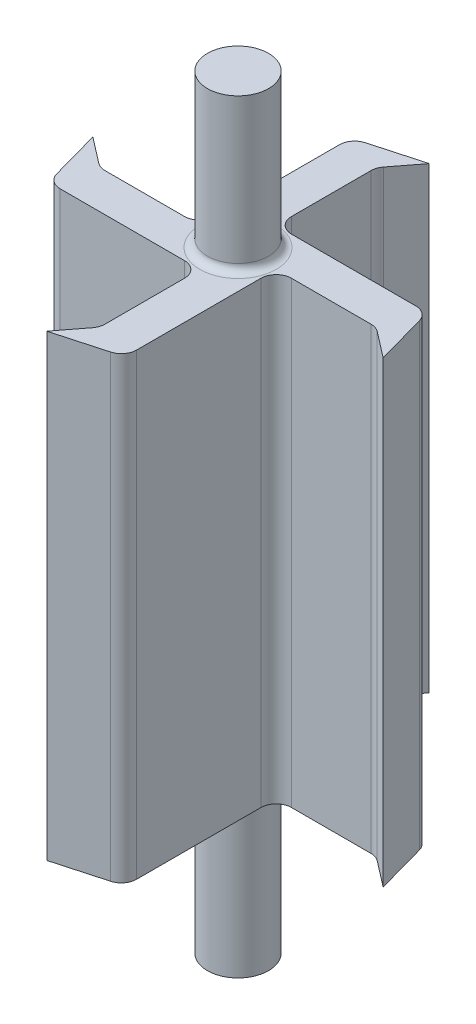
ISO-10303-21;
HEADER;
FILE_DESCRIPTION(('STEP AP214'),'2;1');
FILE_NAME('part.step','',(''),(''),'','','');
FILE_SCHEMA(('AUTOMOTIVE_DESIGN { 1 0 10303 214 1 1 1 1 }'));
ENDSEC;
DATA;
#1=APPLICATION_CONTEXT('core data for automotive mechanical design processes');
#2=APPLICATION_PROTOCOL_DEFINITION('international standard','automotive_design',2000,#1);
#3=PRODUCT_CONTEXT('',#1,'mechanical');
#4=PRODUCT('Part','Part','',(#3));
#5=PRODUCT_RELATED_PRODUCT_CATEGORY('part','',(#4));
#6=PRODUCT_DEFINITION_FORMATION('','',#4);
#7=PRODUCT_DEFINITION_CONTEXT('part definition',#1,'design');
#8=PRODUCT_DEFINITION('design','',#6,#7);
#9=PRODUCT_DEFINITION_SHAPE('','',#8);
#10=(LENGTH_UNIT() NAMED_UNIT(*) SI_UNIT(.MILLI.,.METRE.));
#11=(NAMED_UNIT(*) PLANE_ANGLE_UNIT() SI_UNIT($,.RADIAN.));
#12=(NAMED_UNIT(*) SI_UNIT($,.STERADIAN.) SOLID_ANGLE_UNIT());
#13=UNCERTAINTY_MEASURE_WITH_UNIT(LENGTH_MEASURE(1.E-05),#10,'distance_accuracy_value','');
#14=(GEOMETRIC_REPRESENTATION_CONTEXT(3) GLOBAL_UNCERTAINTY_ASSIGNED_CONTEXT((#13)) GLOBAL_UNIT_ASSIGNED_CONTEXT((#10,
#11,#12)) REPRESENTATION_CONTEXT('',''));
#15=CARTESIAN_POINT('',(0.,0.,0.));
#16=DIRECTION('',(0.,0.,1.));
#17=DIRECTION('',(1.,0.,0.));
#18=AXIS2_PLACEMENT_3D('',#15,#16,#17);
#19=CARTESIAN_POINT('',(0.,60.,-5.));
#20=DIRECTION('',(0.,0.,-1.));
#21=DIRECTION('',(-1.,0.,0.));
#22=AXIS2_PLACEMENT_3D('',#19,#20,#21);
#23=PLANE('',#22);
#24=DIRECTION('',(1.,0.,0.));
#25=VECTOR('',#24,1.);
#26=CARTESIAN_POINT('',(0.,0.,-5.));
#27=LINE('',#26,#25);
#28=CARTESIAN_POINT('',(1.99999999999998,0.,-4.99999999999999));
#29=VERTEX_POINT('',#28);
#30=CARTESIAN_POINT('',(18.270384004832,0.,-4.99999999999994));
#31=VERTEX_POINT('',#30);
#32=EDGE_CURVE('E286',#29,#31,#27,.T.);
#33=ORIENTED_EDGE('',*,*,#32,.F.);
#34=DIRECTION('',(0.,-1.,0.));
#35=VECTOR('',#34,1.);
#36=CARTESIAN_POINT('',(1.99999999999998,60.,-4.99999999999999));
#37=LINE('',#36,#35);
#38=CARTESIAN_POINT('',(1.99999999999998,60.,-4.99999999999999));
#39=VERTEX_POINT('',#38);
#40=EDGE_CURVE('E387',#29,#39,#37,.F.);
#41=ORIENTED_EDGE('',*,*,#40,.T.);
#42=DIRECTION('',(1.,0.,0.));
#43=VECTOR('',#42,1.);
#44=CARTESIAN_POINT('',(0.,60.,-5.));
#45=LINE('',#44,#43);
#46=CARTESIAN_POINT('',(18.270384004832,60.,-4.99999999999994));
#47=VERTEX_POINT('',#46);
#48=EDGE_CURVE('E328',#39,#47,#45,.T.);
#49=ORIENTED_EDGE('',*,*,#48,.T.);
#50=DIRECTION('',(0.,-1.,0.));
#51=VECTOR('',#50,1.);
#52=CARTESIAN_POINT('',(18.270384004832,0.,-4.99999999999994));
#53=LINE('',#52,#51);
#54=EDGE_CURVE('E384',#47,#31,#53,.T.);
#55=ORIENTED_EDGE('',*,*,#54,.T.);
#56=EDGE_LOOP('',(#33,#41,#49,#55));
#57=FACE_BOUND('',#56,.T.);
#58=ADVANCED_FACE('F35',(#57),#23,.T.);
#59=CARTESIAN_POINT('',(0.,60.,0.));
#60=DIRECTION('',(1.,0.,0.));
#61=DIRECTION('',(0.,0.,-1.));
#62=AXIS2_PLACEMENT_3D('',#59,#60,#61);
#63=PLANE('',#62);
#64=DIRECTION('',(0.,0.,1.));
#65=VECTOR('',#64,1.);
#66=CARTESIAN_POINT('',(0.,60.,0.));
#67=LINE('',#66,#65);
#68=CARTESIAN_POINT('',(0.,60.,-17.4155207280463));
#69=VERTEX_POINT('',#68);
#70=CARTESIAN_POINT('',(0.,60.,-6.99999999999999));
#71=VERTEX_POINT('',#70);
#72=EDGE_CURVE('E235',#69,#71,#67,.T.);
#73=ORIENTED_EDGE('',*,*,#72,.T.);
#74=DIRECTION('',(0.,-1.,0.));
#75=VECTOR('',#74,1.);
#76=CARTESIAN_POINT('',(0.,0.,-6.99999999999999));
#77=LINE('',#76,#75);
#78=CARTESIAN_POINT('',(0.,0.,-6.99999999999999));
#79=VERTEX_POINT('',#78);
#80=EDGE_CURVE('E381',#71,#79,#77,.T.);
#81=ORIENTED_EDGE('',*,*,#80,.T.);
#82=DIRECTION('',(0.,0.,1.));
#83=VECTOR('',#82,1.);
#84=CARTESIAN_POINT('',(0.,0.,0.));
#85=LINE('',#84,#83);
#86=CARTESIAN_POINT('',(0.,0.,-17.4155207280463));
#87=VERTEX_POINT('',#86);
#88=EDGE_CURVE('E289',#87,#79,#85,.T.);
#89=ORIENTED_EDGE('',*,*,#88,.F.);
#90=DIRECTION('',(0.,-1.,0.));
#91=VECTOR('',#90,1.);
#92=CARTESIAN_POINT('',(0.,60.,-17.4155207280463));
#93=LINE('',#92,#91);
#94=EDGE_CURVE('E379',#87,#69,#93,.F.);
#95=ORIENTED_EDGE('',*,*,#94,.T.);
#96=EDGE_LOOP('',(#73,#81,#89,#95));
#97=FACE_BOUND('',#96,.T.);
#98=ADVANCED_FACE('F457',(#97),#63,.T.);
#99=CARTESIAN_POINT('',(-8.74677947666396,60.,-6.73263582037778));
#100=DIRECTION('',(-0.792433760747938,0.,-0.609957977918873));
#101=DIRECTION('',(-0.609957977918873,0.,0.792433760747938));
#102=AXIS2_PLACEMENT_3D('',#99,#100,#101);
#103=PLANE('',#102);
#104=DIRECTION('',(0.609957977918873,0.,-0.792433760747938));
#105=VECTOR('',#104,1.);
#106=CARTESIAN_POINT('',(-8.74677947666396,60.,-6.73263582037778));
#107=LINE('',#106,#105);
#108=CARTESIAN_POINT('',(0.415132478504087,60.,-18.6354366838841));
#109=VERTEX_POINT('',#108);
#110=CARTESIAN_POINT('',(3.017767954205,60.,-22.0166798064062));
#111=VERTEX_POINT('',#110);
#112=EDGE_CURVE('E222',#109,#111,#107,.T.);
#113=ORIENTED_EDGE('',*,*,#112,.F.);
#114=DIRECTION('',(0.,-1.,0.));
#115=VECTOR('',#114,1.);
#116=CARTESIAN_POINT('',(0.415132478504086,60.,-18.6354366838841));
#117=LINE('',#116,#115);
#118=CARTESIAN_POINT('',(0.415132478504087,0.,-18.6354366838841));
#119=VERTEX_POINT('',#118);
#120=EDGE_CURVE('E405',#109,#119,#117,.T.);
#121=ORIENTED_EDGE('',*,*,#120,.T.);
#122=DIRECTION('',(0.609957977918873,0.,-0.792433760747938));
#123=VECTOR('',#122,1.);
#124=CARTESIAN_POINT('',(-8.74677947666396,0.,-6.73263582037778));
#125=LINE('',#124,#123);
#126=CARTESIAN_POINT('',(3.017767954205,0.,-22.0166798064062));
#127=VERTEX_POINT('',#126);
#128=EDGE_CURVE('E241',#119,#127,#125,.T.);
#129=ORIENTED_EDGE('',*,*,#128,.T.);
#130=DIRECTION('',(0.,-1.,0.));
#131=VECTOR('',#130,1.);
#132=CARTESIAN_POINT('',(3.017767954205,60.,-22.0166798064062));
#133=LINE('',#132,#131);
#134=EDGE_CURVE('E238',#111,#127,#133,.T.);
#135=ORIENTED_EDGE('',*,*,#134,.F.);
#136=EDGE_LOOP('',(#113,#121,#129,#135));
#137=FACE_BOUND('',#136,.T.);
#138=ADVANCED_FACE('F239',(#137),#103,.F.);
#139=CARTESIAN_POINT('',(-5.45894759484827,60.,-19.6633732056079));
#140=DIRECTION('',(0.267502810869766,0.,0.96355707987476));
#141=DIRECTION('',(0.96355707987476,0.,-0.267502810869766));
#142=AXIS2_PLACEMENT_3D('',#139,#140,#141);
#143=PLANE('',#142);
#144=DIRECTION('',(-0.96355707987476,0.,0.267502810869766));
#145=VECTOR('',#144,1.);
#146=CARTESIAN_POINT('',(-5.45894759484827,0.,-19.6633732056079));
#147=LINE('',#146,#145);
#148=CARTESIAN_POINT('',(-3.53500562173953,0.,-20.1974981645816));
#149=VERTEX_POINT('',#148);
#150=EDGE_CURVE('E294',#127,#149,#147,.T.);
#151=ORIENTED_EDGE('',*,*,#150,.T.);
#152=DIRECTION('',(0.,-1.,0.));
#153=VECTOR('',#152,1.);
#154=CARTESIAN_POINT('',(-3.53500562173953,60.,-20.1974981645816));
#155=LINE('',#154,#153);
#156=CARTESIAN_POINT('',(-3.53500562173953,60.,-20.1974981645816));
#157=VERTEX_POINT('',#156);
#158=EDGE_CURVE('E250',#149,#157,#155,.F.);
#159=ORIENTED_EDGE('',*,*,#158,.T.);
#160=DIRECTION('',(-0.96355707987476,0.,0.267502810869766));
#161=VECTOR('',#160,1.);
#162=CARTESIAN_POINT('',(-5.45894759484827,60.,-19.6633732056079));
#163=LINE('',#162,#161);
#164=EDGE_CURVE('E227',#111,#157,#163,.T.);
#165=ORIENTED_EDGE('',*,*,#164,.F.);
#166=ORIENTED_EDGE('',*,*,#134,.T.);
#167=EDGE_LOOP('',(#151,#159,#165,#166));
#168=FACE_BOUND('',#167,.T.);
#169=ADVANCED_FACE('F248',(#168),#143,.F.);
#170=CARTESIAN_POINT('',(-5.,60.,0.));
#171=DIRECTION('',(-1.,0.,0.));
#172=DIRECTION('',(0.,0.,1.));
#173=AXIS2_PLACEMENT_3D('',#170,#171,#172);
#174=PLANE('',#173);
#175=DIRECTION('',(0.,0.,-1.));
#176=VECTOR('',#175,1.);
#177=CARTESIAN_POINT('',(-5.,0.,0.));
#178=LINE('',#177,#176);
#179=CARTESIAN_POINT('',(-5.,0.,-2.0000000000001));
#180=VERTEX_POINT('',#179);
#181=CARTESIAN_POINT('',(-5.,0.,-18.270384004832));
#182=VERTEX_POINT('',#181);
#183=EDGE_CURVE('E296',#180,#182,#178,.T.);
#184=ORIENTED_EDGE('',*,*,#183,.F.);
#185=DIRECTION('',(0.,-1.,0.));
#186=VECTOR('',#185,1.);
#187=CARTESIAN_POINT('',(-5.,60.,-2.0000000000001));
#188=LINE('',#187,#186);
#189=CARTESIAN_POINT('',(-5.,60.,-2.0000000000001));
#190=VERTEX_POINT('',#189);
#191=EDGE_CURVE('E343',#180,#190,#188,.F.);
#192=ORIENTED_EDGE('',*,*,#191,.T.);
#193=DIRECTION('',(0.,0.,-1.));
#194=VECTOR('',#193,1.);
#195=CARTESIAN_POINT('',(-5.,60.,0.));
#196=LINE('',#195,#194);
#197=CARTESIAN_POINT('',(-5.,60.,-18.270384004832));
#198=VERTEX_POINT('',#197);
#199=EDGE_CURVE('E251',#190,#198,#196,.T.);
#200=ORIENTED_EDGE('',*,*,#199,.T.);
#201=DIRECTION('',(0.,-1.,0.));
#202=VECTOR('',#201,1.);
#203=CARTESIAN_POINT('',(-5.,0.,-18.270384004832));
#204=LINE('',#203,#202);
#205=EDGE_CURVE('E340',#198,#182,#204,.T.);
#206=ORIENTED_EDGE('',*,*,#205,.T.);
#207=EDGE_LOOP('',(#184,#192,#200,#206));
#208=FACE_BOUND('',#207,.T.);
#209=ADVANCED_FACE('F528',(#208),#174,.T.);
#210=CARTESIAN_POINT('',(0.,60.,0.));
#211=DIRECTION('',(0.,0.,-1.));
#212=DIRECTION('',(-1.,0.,0.));
#213=AXIS2_PLACEMENT_3D('',#210,#211,#212);
#214=PLANE('',#213);
#215=DIRECTION('',(1.,0.,0.));
#216=VECTOR('',#215,1.);
#217=CARTESIAN_POINT('',(0.,60.,0.));
#218=LINE('',#217,#216);
#219=CARTESIAN_POINT('',(-17.4155207280465,60.,-2.37645738086547E-13));
#220=VERTEX_POINT('',#219);
#221=CARTESIAN_POINT('',(-7.00000000000003,60.,0.));
#222=VERTEX_POINT('',#221);
#223=EDGE_CURVE('E254',#220,#222,#218,.T.);
#224=ORIENTED_EDGE('',*,*,#223,.T.);
#225=DIRECTION('',(0.,-1.,0.));
#226=VECTOR('',#225,1.);
#227=CARTESIAN_POINT('',(-7.00000000000003,0.,0.));
#228=LINE('',#227,#226);
#229=CARTESIAN_POINT('',(-7.00000000000003,0.,0.));
#230=VERTEX_POINT('',#229);
#231=EDGE_CURVE('E337',#222,#230,#228,.T.);
#232=ORIENTED_EDGE('',*,*,#231,.T.);
#233=DIRECTION('',(1.,0.,0.));
#234=VECTOR('',#233,1.);
#235=CARTESIAN_POINT('',(0.,0.,0.));
#236=LINE('',#235,#234);
#237=CARTESIAN_POINT('',(-17.4155207280465,0.,-2.37645738086547E-13));
#238=VERTEX_POINT('',#237);
#239=EDGE_CURVE('E299',#238,#230,#236,.T.);
#240=ORIENTED_EDGE('',*,*,#239,.F.);
#241=DIRECTION('',(0.,-1.,0.));
#242=VECTOR('',#241,1.);
#243=CARTESIAN_POINT('',(-17.4155207280465,60.,-2.37645738086547E-13));
#244=LINE('',#243,#242);
#245=EDGE_CURVE('E245',#238,#220,#244,.F.);
#246=ORIENTED_EDGE('',*,*,#245,.T.);
#247=EDGE_LOOP('',(#224,#232,#240,#246));
#248=FACE_BOUND('',#247,.T.);
#249=ADVANCED_FACE('F534',(#248),#214,.T.);
#250=CARTESIAN_POINT('',(-6.73263582037788,60.,8.74677947666389));
#251=DIRECTION('',(-0.609957977918881,0.,0.792433760747931));
#252=DIRECTION('',(0.792433760747931,0.,0.609957977918881));
#253=AXIS2_PLACEMENT_3D('',#250,#251,#252);
#254=PLANE('',#253);
#255=DIRECTION('',(-0.792433760747932,0.,-0.609957977918881));
#256=VECTOR('',#255,1.);
#257=CARTESIAN_POINT('',(-6.73263582037788,60.,8.74677947666389));
#258=LINE('',#257,#256);
#259=CARTESIAN_POINT('',(-18.6354366838842,60.,-0.415132478504377));
#260=VERTEX_POINT('',#259);
#261=CARTESIAN_POINT('',(-22.0166798064061,60.,-3.01776795420523));
#262=VERTEX_POINT('',#261);
#263=EDGE_CURVE('E260',#260,#262,#258,.T.);
#264=ORIENTED_EDGE('',*,*,#263,.F.);
#265=DIRECTION('',(0.,-1.,0.));
#266=VECTOR('',#265,1.);
#267=CARTESIAN_POINT('',(-18.6354366838842,60.,-0.415132478504374));
#268=LINE('',#267,#266);
#269=CARTESIAN_POINT('',(-18.6354366838842,0.,-0.415132478504377));
#270=VERTEX_POINT('',#269);
#271=EDGE_CURVE('E376',#260,#270,#268,.T.);
#272=ORIENTED_EDGE('',*,*,#271,.T.);
#273=DIRECTION('',(-0.792433760747932,0.,-0.609957977918881));
#274=VECTOR('',#273,1.);
#275=CARTESIAN_POINT('',(-6.73263582037788,0.,8.74677947666389));
#276=LINE('',#275,#274);
#277=CARTESIAN_POINT('',(-22.0166798064061,0.,-3.01776795420523));
#278=VERTEX_POINT('',#277);
#279=EDGE_CURVE('E302',#270,#278,#276,.T.);
#280=ORIENTED_EDGE('',*,*,#279,.T.);
#281=DIRECTION('',(0.,-1.,0.));
#282=VECTOR('',#281,1.);
#283=CARTESIAN_POINT('',(-22.0166798064061,60.,-3.01776795420523));
#284=LINE('',#283,#282);
#285=EDGE_CURVE('E246',#262,#278,#284,.T.);
#286=ORIENTED_EDGE('',*,*,#285,.F.);
#287=EDGE_LOOP('',(#264,#272,#280,#286));
#288=FACE_BOUND('',#287,.T.);
#289=ADVANCED_FACE('F541',(#288),#254,.F.);
#290=CARTESIAN_POINT('',(-19.6633732056079,60.,5.45894759484807));
#291=DIRECTION('',(0.963557079874762,0.,-0.267502810869756));
#292=DIRECTION('',(-0.267502810869756,0.,-0.963557079874763));
#293=AXIS2_PLACEMENT_3D('',#290,#291,#292);
#294=PLANE('',#293);
#295=DIRECTION('',(0.267502810869756,0.,0.963557079874763));
#296=VECTOR('',#295,1.);
#297=CARTESIAN_POINT('',(-19.6633732056079,0.,5.45894759484807));
#298=LINE('',#297,#296);
#299=CARTESIAN_POINT('',(-20.1974981645816,0.,3.53500562173932));
#300=VERTEX_POINT('',#299);
#301=EDGE_CURVE('E304',#278,#300,#298,.T.);
#302=ORIENTED_EDGE('',*,*,#301,.T.);
#303=DIRECTION('',(0.,-1.,0.));
#304=VECTOR('',#303,1.);
#305=CARTESIAN_POINT('',(-20.1974981645816,60.,3.53500562173932));
#306=LINE('',#305,#304);
#307=CARTESIAN_POINT('',(-20.1974981645816,60.,3.53500562173932));
#308=VERTEX_POINT('',#307);
#309=EDGE_CURVE('E366',#300,#308,#306,.F.);
#310=ORIENTED_EDGE('',*,*,#309,.T.);
#311=DIRECTION('',(0.267502810869756,0.,0.963557079874763));
#312=VECTOR('',#311,1.);
#313=CARTESIAN_POINT('',(-19.6633732056079,60.,5.45894759484807));
#314=LINE('',#313,#312);
#315=EDGE_CURVE('E262',#262,#308,#314,.T.);
#316=ORIENTED_EDGE('',*,*,#315,.F.);
#317=ORIENTED_EDGE('',*,*,#285,.T.);
#318=EDGE_LOOP('',(#302,#310,#316,#317));
#319=FACE_BOUND('',#318,.T.);
#320=ADVANCED_FACE('F546',(#319),#294,.F.);
#321=CARTESIAN_POINT('',(0.,60.,5.));
#322=DIRECTION('',(0.,0.,1.));
#323=DIRECTION('',(1.,0.,0.));
#324=AXIS2_PLACEMENT_3D('',#321,#322,#323);
#325=PLANE('',#324);
#326=DIRECTION('',(-1.,0.,0.));
#327=VECTOR('',#326,1.);
#328=CARTESIAN_POINT('',(0.,60.,5.));
#329=LINE('',#328,#327);
#330=CARTESIAN_POINT('',(-2.00000000000002,60.,4.99999999999998));
#331=VERTEX_POINT('',#330);
#332=CARTESIAN_POINT('',(-18.2703840048321,60.,4.99999999999981));
#333=VERTEX_POINT('',#332);
#334=EDGE_CURVE('E264',#331,#333,#329,.T.);
#335=ORIENTED_EDGE('',*,*,#334,.T.);
#336=DIRECTION('',(0.,-1.,0.));
#337=VECTOR('',#336,1.);
#338=CARTESIAN_POINT('',(-18.2703840048321,0.,4.99999999999981));
#339=LINE('',#338,#337);
#340=CARTESIAN_POINT('',(-18.2703840048321,0.,4.99999999999981));
#341=VERTEX_POINT('',#340);
#342=EDGE_CURVE('E355',#333,#341,#339,.T.);
#343=ORIENTED_EDGE('',*,*,#342,.T.);
#344=DIRECTION('',(-1.,0.,0.));
#345=VECTOR('',#344,1.);
#346=CARTESIAN_POINT('',(0.,0.,5.));
#347=LINE('',#346,#345);
#348=CARTESIAN_POINT('',(-2.00000000000002,0.,4.99999999999998));
#349=VERTEX_POINT('',#348);
#350=EDGE_CURVE('E307',#349,#341,#347,.T.);
#351=ORIENTED_EDGE('',*,*,#350,.F.);
#352=DIRECTION('',(0.,-1.,0.));
#353=VECTOR('',#352,1.);
#354=CARTESIAN_POINT('',(-2.00000000000002,60.,4.99999999999998));
#355=LINE('',#354,#353);
#356=EDGE_CURVE('E353',#349,#331,#355,.F.);
#357=ORIENTED_EDGE('',*,*,#356,.T.);
#358=EDGE_LOOP('',(#335,#343,#351,#357));
#359=FACE_BOUND('',#358,.T.);
#360=ADVANCED_FACE('F553',(#359),#325,.T.);
#361=CARTESIAN_POINT('',(0.,60.,0.));
#362=DIRECTION('',(-1.,0.,0.));
#363=DIRECTION('',(0.,0.,1.));
#364=AXIS2_PLACEMENT_3D('',#361,#362,#363);
#365=PLANE('',#364);
#366=DIRECTION('',(0.,0.,-1.));
#367=VECTOR('',#366,1.);
#368=CARTESIAN_POINT('',(0.,0.,0.));
#369=LINE('',#368,#367);
#370=CARTESIAN_POINT('',(-1.0085004405049E-13,0.,17.4155207280463));
#371=VERTEX_POINT('',#370);
#372=CARTESIAN_POINT('',(0.,0.,6.99999999999999));
#373=VERTEX_POINT('',#372);
#374=EDGE_CURVE('E310',#371,#373,#369,.T.);
#375=ORIENTED_EDGE('',*,*,#374,.F.);
#376=DIRECTION('',(0.,-1.,0.));
#377=VECTOR('',#376,1.);
#378=CARTESIAN_POINT('',(-1.0085004405049E-13,60.,17.4155207280463));
#379=LINE('',#378,#377);
#380=CARTESIAN_POINT('',(-1.0085004405049E-13,60.,17.4155207280463));
#381=VERTEX_POINT('',#380);
#382=EDGE_CURVE('E351',#371,#381,#379,.F.);
#383=ORIENTED_EDGE('',*,*,#382,.T.);
#384=DIRECTION('',(0.,0.,-1.));
#385=VECTOR('',#384,1.);
#386=CARTESIAN_POINT('',(0.,60.,0.));
#387=LINE('',#386,#385);
#388=CARTESIAN_POINT('',(0.,60.,6.99999999999999));
#389=VERTEX_POINT('',#388);
#390=EDGE_CURVE('E267',#381,#389,#387,.T.);
#391=ORIENTED_EDGE('',*,*,#390,.T.);
#392=DIRECTION('',(0.,-1.,0.));
#393=VECTOR('',#392,1.);
#394=CARTESIAN_POINT('',(0.,0.,6.99999999999999));
#395=LINE('',#394,#393);
#396=EDGE_CURVE('E348',#389,#373,#395,.T.);
#397=ORIENTED_EDGE('',*,*,#396,.T.);
#398=EDGE_LOOP('',(#375,#383,#391,#397));
#399=FACE_BOUND('',#398,.T.);
#400=ADVANCED_FACE('F560',(#399),#365,.T.);
#401=CARTESIAN_POINT('',(8.74677947666391,60.,6.73263582037784));
#402=DIRECTION('',(0.792433760747934,0.,0.609957977918878));
#403=DIRECTION('',(0.609957977918878,0.,-0.792433760747934));
#404=AXIS2_PLACEMENT_3D('',#401,#402,#403);
#405=PLANE('',#404);
#406=DIRECTION('',(-0.609957977918878,0.,0.792433760747934));
#407=VECTOR('',#406,1.);
#408=CARTESIAN_POINT('',(8.74677947666391,60.,6.73263582037784));
#409=LINE('',#408,#407);
#410=CARTESIAN_POINT('',(-0.415132478504233,60.,18.6354366838841));
#411=VERTEX_POINT('',#410);
#412=CARTESIAN_POINT('',(-3.01776795420515,60.,22.0166798064061));
#413=VERTEX_POINT('',#412);
#414=EDGE_CURVE('E270',#411,#413,#409,.T.);
#415=ORIENTED_EDGE('',*,*,#414,.F.);
#416=DIRECTION('',(0.,-1.,0.));
#417=VECTOR('',#416,1.);
#418=CARTESIAN_POINT('',(-0.415132478504231,60.,18.6354366838841));
#419=LINE('',#418,#417);
#420=CARTESIAN_POINT('',(-0.415132478504233,0.,18.6354366838841));
#421=VERTEX_POINT('',#420);
#422=EDGE_CURVE('E345',#411,#421,#419,.T.);
#423=ORIENTED_EDGE('',*,*,#422,.T.);
#424=DIRECTION('',(-0.609957977918878,0.,0.792433760747934));
#425=VECTOR('',#424,1.);
#426=CARTESIAN_POINT('',(8.74677947666391,0.,6.73263582037784));
#427=LINE('',#426,#425);
#428=CARTESIAN_POINT('',(-3.01776795420515,0.,22.0166798064061));
#429=VERTEX_POINT('',#428);
#430=EDGE_CURVE('E313',#421,#429,#427,.T.);
#431=ORIENTED_EDGE('',*,*,#430,.T.);
#432=DIRECTION('',(0.,-1.,0.));
#433=VECTOR('',#432,1.);
#434=CARTESIAN_POINT('',(-3.01776795420515,60.,22.0166798064061));
#435=LINE('',#434,#433);
#436=EDGE_CURVE('E331',#413,#429,#435,.T.);
#437=ORIENTED_EDGE('',*,*,#436,.F.);
#438=EDGE_LOOP('',(#415,#423,#431,#437));
#439=FACE_BOUND('',#438,.T.);
#440=ADVANCED_FACE('F568',(#439),#405,.F.);
#441=CARTESIAN_POINT('',(5.45894759484814,60.,19.6633732056079));
#442=DIRECTION('',(-0.267502810869759,0.,-0.963557079874762));
#443=DIRECTION('',(-0.963557079874762,0.,0.267502810869759));
#444=AXIS2_PLACEMENT_3D('',#441,#442,#443);
#445=PLANE('',#444);
#446=DIRECTION('',(0.963557079874762,0.,-0.267502810869759));
#447=VECTOR('',#446,1.);
#448=CARTESIAN_POINT('',(5.45894759484814,0.,19.6633732056079));
#449=LINE('',#448,#447);
#450=CARTESIAN_POINT('',(3.53500562173939,0.,20.1974981645816));
#451=VERTEX_POINT('',#450);
#452=EDGE_CURVE('E315',#429,#451,#449,.T.);
#453=ORIENTED_EDGE('',*,*,#452,.T.);
#454=DIRECTION('',(0.,-1.,0.));
#455=VECTOR('',#454,1.);
#456=CARTESIAN_POINT('',(3.53500562173939,60.,20.1974981645816));
#457=LINE('',#456,#455);
#458=CARTESIAN_POINT('',(3.53500562173939,60.,20.1974981645816));
#459=VERTEX_POINT('',#458);
#460=EDGE_CURVE('E399',#451,#459,#457,.F.);
#461=ORIENTED_EDGE('',*,*,#460,.T.);
#462=DIRECTION('',(0.963557079874762,0.,-0.267502810869759));
#463=VECTOR('',#462,1.);
#464=CARTESIAN_POINT('',(5.45894759484814,60.,19.6633732056079));
#465=LINE('',#464,#463);
#466=EDGE_CURVE('E272',#413,#459,#465,.T.);
#467=ORIENTED_EDGE('',*,*,#466,.F.);
#468=ORIENTED_EDGE('',*,*,#436,.T.);
#469=EDGE_LOOP('',(#453,#461,#467,#468));
#470=FACE_BOUND('',#469,.T.);
#471=ADVANCED_FACE('F573',(#470),#445,.F.);
#472=CARTESIAN_POINT('',(5.,60.,0.));
#473=DIRECTION('',(1.,0.,0.));
#474=DIRECTION('',(0.,0.,-1.));
#475=AXIS2_PLACEMENT_3D('',#472,#473,#474);
#476=PLANE('',#475);
#477=DIRECTION('',(0.,0.,1.));
#478=VECTOR('',#477,1.);
#479=CARTESIAN_POINT('',(5.,0.,0.));
#480=LINE('',#479,#478);
#481=CARTESIAN_POINT('',(4.99999999999999,0.,2.));
#482=VERTEX_POINT('',#481);
#483=CARTESIAN_POINT('',(4.99999999999987,0.,18.2703840048321));
#484=VERTEX_POINT('',#483);
#485=EDGE_CURVE('E318',#482,#484,#480,.T.);
#486=ORIENTED_EDGE('',*,*,#485,.F.);
#487=DIRECTION('',(0.,-1.,0.));
#488=VECTOR('',#487,1.);
#489=CARTESIAN_POINT('',(4.99999999999999,60.,2.));
#490=LINE('',#489,#488);
#491=CARTESIAN_POINT('',(4.99999999999999,60.,2.));
#492=VERTEX_POINT('',#491);
#493=EDGE_CURVE('E397',#482,#492,#490,.F.);
#494=ORIENTED_EDGE('',*,*,#493,.T.);
#495=DIRECTION('',(0.,0.,1.));
#496=VECTOR('',#495,1.);
#497=CARTESIAN_POINT('',(5.,60.,0.));
#498=LINE('',#497,#496);
#499=CARTESIAN_POINT('',(4.99999999999987,60.,18.2703840048321));
#500=VERTEX_POINT('',#499);
#501=EDGE_CURVE('E275',#492,#500,#498,.T.);
#502=ORIENTED_EDGE('',*,*,#501,.T.);
#503=DIRECTION('',(0.,-1.,0.));
#504=VECTOR('',#503,1.);
#505=CARTESIAN_POINT('',(4.99999999999987,0.,18.2703840048321));
#506=LINE('',#505,#504);
#507=EDGE_CURVE('E394',#500,#484,#506,.T.);
#508=ORIENTED_EDGE('',*,*,#507,.T.);
#509=EDGE_LOOP('',(#486,#494,#502,#508));
#510=FACE_BOUND('',#509,.T.);
#511=ADVANCED_FACE('F581',(#510),#476,.T.);
#512=CARTESIAN_POINT('',(0.,60.,0.));
#513=DIRECTION('',(0.,0.,1.));
#514=DIRECTION('',(1.,0.,0.));
#515=AXIS2_PLACEMENT_3D('',#512,#513,#514);
#516=PLANE('',#515);
#517=DIRECTION('',(-1.,0.,0.));
#518=VECTOR('',#517,1.);
#519=CARTESIAN_POINT('',(0.,60.,0.));
#520=LINE('',#519,#518);
#521=CARTESIAN_POINT('',(17.4155207280463,60.,0.));
#522=VERTEX_POINT('',#521);
#523=CARTESIAN_POINT('',(6.99999999999999,60.,0.));
#524=VERTEX_POINT('',#523);
#525=EDGE_CURVE('E278',#522,#524,#520,.T.);
#526=ORIENTED_EDGE('',*,*,#525,.T.);
#527=DIRECTION('',(0.,-1.,0.));
#528=VECTOR('',#527,1.);
#529=CARTESIAN_POINT('',(6.99999999999999,0.,0.));
#530=LINE('',#529,#528);
#531=CARTESIAN_POINT('',(6.99999999999999,0.,0.));
#532=VERTEX_POINT('',#531);
#533=EDGE_CURVE('E391',#524,#532,#530,.T.);
#534=ORIENTED_EDGE('',*,*,#533,.T.);
#535=DIRECTION('',(-1.,0.,0.));
#536=VECTOR('',#535,1.);
#537=CARTESIAN_POINT('',(0.,0.,0.));
#538=LINE('',#537,#536);
#539=CARTESIAN_POINT('',(17.4155207280463,0.,0.));
#540=VERTEX_POINT('',#539);
#541=EDGE_CURVE('E321',#540,#532,#538,.T.);
#542=ORIENTED_EDGE('',*,*,#541,.F.);
#543=DIRECTION('',(0.,-1.,0.));
#544=VECTOR('',#543,1.);
#545=CARTESIAN_POINT('',(17.4155207280463,60.,0.));
#546=LINE('',#545,#544);
#547=EDGE_CURVE('E389',#540,#522,#546,.F.);
#548=ORIENTED_EDGE('',*,*,#547,.T.);
#549=EDGE_LOOP('',(#526,#534,#542,#548));
#550=FACE_BOUND('',#549,.T.);
#551=ADVANCED_FACE('F585',(#550),#516,.T.);
#552=CARTESIAN_POINT('',(6.73263582037781,60.,-8.74677947666394));
#553=DIRECTION('',(0.609957977918875,0.,-0.792433760747936));
#554=DIRECTION('',(-0.792433760747936,0.,-0.609957977918876));
#555=AXIS2_PLACEMENT_3D('',#552,#553,#554);
#556=PLANE('',#555);
#557=DIRECTION('',(0.792433760747936,0.,0.609957977918876));
#558=VECTOR('',#557,1.);
#559=CARTESIAN_POINT('',(6.73263582037781,60.,-8.74677947666394));
#560=LINE('',#559,#558);
#561=CARTESIAN_POINT('',(18.6354366838841,60.,0.415132478504171));
#562=VERTEX_POINT('',#561);
#563=CARTESIAN_POINT('',(22.0166798064061,60.,3.01776795420507));
#564=VERTEX_POINT('',#563);
#565=EDGE_CURVE('E281',#562,#564,#560,.T.);
#566=ORIENTED_EDGE('',*,*,#565,.F.);
#567=DIRECTION('',(0.,-1.,0.));
#568=VECTOR('',#567,1.);
#569=CARTESIAN_POINT('',(18.6354366838841,60.,0.415132478504169));
#570=LINE('',#569,#568);
#571=CARTESIAN_POINT('',(18.6354366838841,0.,0.415132478504171));
#572=VERTEX_POINT('',#571);
#573=EDGE_CURVE('E401',#562,#572,#570,.T.);
#574=ORIENTED_EDGE('',*,*,#573,.T.);
#575=DIRECTION('',(0.792433760747936,0.,0.609957977918876));
#576=VECTOR('',#575,1.);
#577=CARTESIAN_POINT('',(6.73263582037781,0.,-8.74677947666394));
#578=LINE('',#577,#576);
#579=CARTESIAN_POINT('',(22.0166798064061,0.,3.01776795420507));
#580=VERTEX_POINT('',#579);
#581=EDGE_CURVE('E324',#572,#580,#578,.T.);
#582=ORIENTED_EDGE('',*,*,#581,.T.);
#583=DIRECTION('',(0.,-1.,0.));
#584=VECTOR('',#583,1.);
#585=CARTESIAN_POINT('',(22.0166798064061,60.,3.01776795420507));
#586=LINE('',#585,#584);
#587=EDGE_CURVE('E285',#564,#580,#586,.T.);
#588=ORIENTED_EDGE('',*,*,#587,.F.);
#589=EDGE_LOOP('',(#566,#574,#582,#588));
#590=FACE_BOUND('',#589,.T.);
#591=ADVANCED_FACE('F591',(#590),#556,.F.);
#592=CARTESIAN_POINT('',(19.6633732056079,60.,-5.45894759484821));
#593=DIRECTION('',(-0.963557079874761,0.,0.267502810869763));
#594=DIRECTION('',(0.267502810869763,0.,0.963557079874761));
#595=AXIS2_PLACEMENT_3D('',#592,#593,#594);
#596=PLANE('',#595);
#597=DIRECTION('',(-0.267502810869763,0.,-0.963557079874761));
#598=VECTOR('',#597,1.);
#599=CARTESIAN_POINT('',(19.6633732056079,0.,-5.45894759484821));
#600=LINE('',#599,#598);
#601=CARTESIAN_POINT('',(20.1974981645816,0.,-3.53500562173946));
#602=VERTEX_POINT('',#601);
#603=EDGE_CURVE('E326',#580,#602,#600,.T.);
#604=ORIENTED_EDGE('',*,*,#603,.T.);
#605=DIRECTION('',(0.,-1.,0.));
#606=VECTOR('',#605,1.);
#607=CARTESIAN_POINT('',(20.1974981645816,60.,-3.53500562173946));
#608=LINE('',#607,#606);
#609=CARTESIAN_POINT('',(20.1974981645816,60.,-3.53500562173946));
#610=VERTEX_POINT('',#609);
#611=EDGE_CURVE('E50',#602,#610,#608,.F.);
#612=ORIENTED_EDGE('',*,*,#611,.T.);
#613=DIRECTION('',(-0.267502810869763,0.,-0.963557079874761));
#614=VECTOR('',#613,1.);
#615=CARTESIAN_POINT('',(19.6633732056079,60.,-5.45894759484821));
#616=LINE('',#615,#614);
#617=EDGE_CURVE('E283',#564,#610,#616,.T.);
#618=ORIENTED_EDGE('',*,*,#617,.F.);
#619=ORIENTED_EDGE('',*,*,#587,.T.);
#620=EDGE_LOOP('',(#604,#612,#618,#619));
#621=FACE_BOUND('',#620,.T.);
#622=ADVANCED_FACE('F594',(#621),#596,.F.);
#623=CARTESIAN_POINT('',(0.,60.,0.));
#624=DIRECTION('',(0.,1.,0.));
#625=DIRECTION('',(0.,0.,1.));
#626=AXIS2_PLACEMENT_3D('',#623,#624,#625);
#627=PLANE('',#626);
#628=CARTESIAN_POINT('',(0.,60.,0.));
#629=DIRECTION('',(0.,1.,0.));
#630=DIRECTION('',(0.,0.,1.));
#631=AXIS2_PLACEMENT_3D('',#628,#629,#630);
#632=CIRCLE('',#631,5.);
#633=CARTESIAN_POINT('',(0.,60.,5.));
#634=VERTEX_POINT('',#633);
#635=EDGE_CURVE('E43',#634,#634,#632,.F.);
#636=ORIENTED_EDGE('',*,*,#635,.T.);
#637=EDGE_LOOP('',(#636));
#638=FACE_BOUND('',#637,.T.);
#639=ORIENTED_EDGE('',*,*,#315,.T.);
#640=CARTESIAN_POINT('',(-18.2703840048321,60.,2.99999999999981));
#641=DIRECTION('',(0.,1.,0.));
#642=DIRECTION('',(0.,0.,1.));
#643=AXIS2_PLACEMENT_3D('',#640,#641,#642);
#644=CIRCLE('',#643,2.);
#645=EDGE_CURVE('E374',#308,#333,#644,.T.);
#646=ORIENTED_EDGE('',*,*,#645,.T.);
#647=ORIENTED_EDGE('',*,*,#334,.F.);
#648=CARTESIAN_POINT('',(-2.00000000000004,60.,6.99999999999998));
#649=DIRECTION('',(0.,1.,0.));
#650=DIRECTION('',(0.,0.,1.));
#651=AXIS2_PLACEMENT_3D('',#648,#649,#650);
#652=CIRCLE('',#651,2.);
#653=EDGE_CURVE('E430',#331,#389,#652,.F.);
#654=ORIENTED_EDGE('',*,*,#653,.T.);
#655=ORIENTED_EDGE('',*,*,#390,.F.);
#656=CARTESIAN_POINT('',(-2.0000000000001,60.,17.4155207280463));
#657=DIRECTION('',(0.,1.,0.));
#658=DIRECTION('',(0.,0.,1.));
#659=AXIS2_PLACEMENT_3D('',#656,#657,#658);
#660=CIRCLE('',#659,2.);
#661=EDGE_CURVE('E414',#381,#411,#660,.F.);
#662=ORIENTED_EDGE('',*,*,#661,.T.);
#663=ORIENTED_EDGE('',*,*,#414,.T.);
#664=ORIENTED_EDGE('',*,*,#466,.T.);
#665=CARTESIAN_POINT('',(2.99999999999987,60.,18.2703840048321));
#666=DIRECTION('',(0.,1.,0.));
#667=DIRECTION('',(0.,0.,1.));
#668=AXIS2_PLACEMENT_3D('',#665,#666,#667);
#669=CIRCLE('',#668,2.);
#670=EDGE_CURVE('E372',#459,#500,#669,.T.);
#671=ORIENTED_EDGE('',*,*,#670,.T.);
#672=ORIENTED_EDGE('',*,*,#501,.F.);
#673=CARTESIAN_POINT('',(6.99999999999999,60.,2.00000000000002));
#674=DIRECTION('',(0.,1.,0.));
#675=DIRECTION('',(0.,0.,1.));
#676=AXIS2_PLACEMENT_3D('',#673,#674,#675);
#677=CIRCLE('',#676,2.);
#678=EDGE_CURVE('E426',#492,#524,#677,.F.);
#679=ORIENTED_EDGE('',*,*,#678,.T.);
#680=ORIENTED_EDGE('',*,*,#525,.F.);
#681=CARTESIAN_POINT('',(17.4155207280463,60.,2.00000000000004));
#682=DIRECTION('',(0.,1.,0.));
#683=DIRECTION('',(0.,0.,1.));
#684=AXIS2_PLACEMENT_3D('',#681,#682,#683);
#685=CIRCLE('',#684,2.);
#686=EDGE_CURVE('E58',#522,#562,#685,.F.);
#687=ORIENTED_EDGE('',*,*,#686,.T.);
#688=ORIENTED_EDGE('',*,*,#565,.T.);
#689=ORIENTED_EDGE('',*,*,#617,.T.);
#690=CARTESIAN_POINT('',(18.270384004832,60.,-2.99999999999994));
#691=DIRECTION('',(0.,1.,0.));
#692=DIRECTION('',(0.,0.,1.));
#693=AXIS2_PLACEMENT_3D('',#690,#691,#692);
#694=CIRCLE('',#693,2.);
#695=EDGE_CURVE('E370',#610,#47,#694,.T.);
#696=ORIENTED_EDGE('',*,*,#695,.T.);
#697=ORIENTED_EDGE('',*,*,#48,.F.);
#698=CARTESIAN_POINT('',(1.99999999999998,60.,-6.99999999999999));
#699=DIRECTION('',(0.,1.,0.));
#700=DIRECTION('',(0.,0.,1.));
#701=AXIS2_PLACEMENT_3D('',#698,#699,#700);
#702=CIRCLE('',#701,2.);
#703=EDGE_CURVE('E422',#39,#71,#702,.F.);
#704=ORIENTED_EDGE('',*,*,#703,.T.);
#705=ORIENTED_EDGE('',*,*,#72,.F.);
#706=CARTESIAN_POINT('',(1.99999999999996,60.,-17.4155207280463));
#707=DIRECTION('',(0.,1.,0.));
#708=DIRECTION('',(0.,0.,1.));
#709=AXIS2_PLACEMENT_3D('',#706,#707,#708);
#710=CIRCLE('',#709,2.);
#711=EDGE_CURVE('E231',#69,#109,#710,.F.);
#712=ORIENTED_EDGE('',*,*,#711,.T.);
#713=ORIENTED_EDGE('',*,*,#112,.T.);
#714=ORIENTED_EDGE('',*,*,#164,.T.);
#715=CARTESIAN_POINT('',(-3.,60.,-18.270384004832));
#716=DIRECTION('',(0.,1.,0.));
#717=DIRECTION('',(0.,0.,1.));
#718=AXIS2_PLACEMENT_3D('',#715,#716,#717);
#719=CIRCLE('',#718,2.);
#720=EDGE_CURVE('E368',#157,#198,#719,.T.);
#721=ORIENTED_EDGE('',*,*,#720,.T.);
#722=ORIENTED_EDGE('',*,*,#199,.F.);
#723=CARTESIAN_POINT('',(-7.,60.,-2.0000000000001));
#724=DIRECTION('',(0.,1.,0.));
#725=DIRECTION('',(0.,0.,1.));
#726=AXIS2_PLACEMENT_3D('',#723,#724,#725);
#727=CIRCLE('',#726,2.);
#728=EDGE_CURVE('E410',#190,#222,#727,.F.);
#729=ORIENTED_EDGE('',*,*,#728,.T.);
#730=ORIENTED_EDGE('',*,*,#223,.F.);
#731=CARTESIAN_POINT('',(-17.4155207280464,60.,-2.00000000000023));
#732=DIRECTION('',(0.,1.,0.));
#733=DIRECTION('',(0.,0.,1.));
#734=AXIS2_PLACEMENT_3D('',#731,#732,#733);
#735=CIRCLE('',#734,2.);
#736=EDGE_CURVE('E418',#220,#260,#735,.F.);
#737=ORIENTED_EDGE('',*,*,#736,.T.);
#738=ORIENTED_EDGE('',*,*,#263,.T.);
#739=EDGE_LOOP('',(#639,#646,#647,#654,#655,#662,#663,#664,#671,#672,#679,#680,#687,#688,#689,
#696,#697,#704,#705,#712,#713,#714,#721,#722,#729,#730,#737,#738));
#740=FACE_BOUND('',#739,.T.);
#741=ADVANCED_FACE('F225',(#638,#740),#627,.T.);
#742=CARTESIAN_POINT('',(0.,0.,0.));
#743=DIRECTION('',(0.,1.,0.));
#744=DIRECTION('',(0.,0.,1.));
#745=AXIS2_PLACEMENT_3D('',#742,#743,#744);
#746=PLANE('',#745);
#747=CARTESIAN_POINT('',(0.,0.,0.));
#748=DIRECTION('',(0.,1.,0.));
#749=DIRECTION('',(0.,0.,1.));
#750=AXIS2_PLACEMENT_3D('',#747,#748,#749);
#751=CIRCLE('',#750,5.);
#752=CARTESIAN_POINT('',(0.,0.,5.));
#753=VERTEX_POINT('',#752);
#754=EDGE_CURVE('E441',#753,#753,#751,.T.);
#755=ORIENTED_EDGE('',*,*,#754,.T.);
#756=EDGE_LOOP('',(#755));
#757=FACE_BOUND('',#756,.T.);
#758=ORIENTED_EDGE('',*,*,#350,.T.);
#759=CARTESIAN_POINT('',(-18.2703840048321,0.,2.99999999999981));
#760=DIRECTION('',(0.,1.,0.));
#761=DIRECTION('',(0.,0.,1.));
#762=AXIS2_PLACEMENT_3D('',#759,#760,#761);
#763=CIRCLE('',#762,2.);
#764=EDGE_CURVE('E364',#341,#300,#763,.F.);
#765=ORIENTED_EDGE('',*,*,#764,.T.);
#766=ORIENTED_EDGE('',*,*,#301,.F.);
#767=ORIENTED_EDGE('',*,*,#279,.F.);
#768=CARTESIAN_POINT('',(-17.4155207280464,0.,-2.00000000000023));
#769=DIRECTION('',(0.,1.,0.));
#770=DIRECTION('',(0.,0.,1.));
#771=AXIS2_PLACEMENT_3D('',#768,#769,#770);
#772=CIRCLE('',#771,2.);
#773=EDGE_CURVE('E416',#270,#238,#772,.T.);
#774=ORIENTED_EDGE('',*,*,#773,.T.);
#775=ORIENTED_EDGE('',*,*,#239,.T.);
#776=CARTESIAN_POINT('',(-7.,0.,-2.0000000000001));
#777=DIRECTION('',(0.,1.,0.));
#778=DIRECTION('',(0.,0.,1.));
#779=AXIS2_PLACEMENT_3D('',#776,#777,#778);
#780=CIRCLE('',#779,2.);
#781=EDGE_CURVE('E408',#230,#180,#780,.T.);
#782=ORIENTED_EDGE('',*,*,#781,.T.);
#783=ORIENTED_EDGE('',*,*,#183,.T.);
#784=CARTESIAN_POINT('',(-3.,0.,-18.270384004832));
#785=DIRECTION('',(0.,1.,0.));
#786=DIRECTION('',(0.,0.,1.));
#787=AXIS2_PLACEMENT_3D('',#784,#785,#786);
#788=CIRCLE('',#787,2.);
#789=EDGE_CURVE('E358',#182,#149,#788,.F.);
#790=ORIENTED_EDGE('',*,*,#789,.T.);
#791=ORIENTED_EDGE('',*,*,#150,.F.);
#792=ORIENTED_EDGE('',*,*,#128,.F.);
#793=CARTESIAN_POINT('',(1.99999999999996,0.,-17.4155207280463));
#794=DIRECTION('',(0.,1.,0.));
#795=DIRECTION('',(0.,0.,1.));
#796=AXIS2_PLACEMENT_3D('',#793,#794,#795);
#797=CIRCLE('',#796,2.);
#798=EDGE_CURVE('E435',#119,#87,#797,.T.);
#799=ORIENTED_EDGE('',*,*,#798,.T.);
#800=ORIENTED_EDGE('',*,*,#88,.T.);
#801=CARTESIAN_POINT('',(1.99999999999998,0.,-6.99999999999999));
#802=DIRECTION('',(0.,1.,0.));
#803=DIRECTION('',(0.,0.,1.));
#804=AXIS2_PLACEMENT_3D('',#801,#802,#803);
#805=CIRCLE('',#804,2.);
#806=EDGE_CURVE('E420',#79,#29,#805,.T.);
#807=ORIENTED_EDGE('',*,*,#806,.T.);
#808=ORIENTED_EDGE('',*,*,#32,.T.);
#809=CARTESIAN_POINT('',(18.270384004832,0.,-2.99999999999994));
#810=DIRECTION('',(0.,1.,0.));
#811=DIRECTION('',(0.,0.,1.));
#812=AXIS2_PLACEMENT_3D('',#809,#810,#811);
#813=CIRCLE('',#812,2.);
#814=EDGE_CURVE('E360',#31,#602,#813,.F.);
#815=ORIENTED_EDGE('',*,*,#814,.T.);
#816=ORIENTED_EDGE('',*,*,#603,.F.);
#817=ORIENTED_EDGE('',*,*,#581,.F.);
#818=CARTESIAN_POINT('',(17.4155207280463,0.,2.00000000000004));
#819=DIRECTION('',(0.,1.,0.));
#820=DIRECTION('',(0.,0.,1.));
#821=AXIS2_PLACEMENT_3D('',#818,#819,#820);
#822=CIRCLE('',#821,2.);
#823=EDGE_CURVE('E432',#572,#540,#822,.T.);
#824=ORIENTED_EDGE('',*,*,#823,.T.);
#825=ORIENTED_EDGE('',*,*,#541,.T.);
#826=CARTESIAN_POINT('',(6.99999999999999,0.,2.00000000000002));
#827=DIRECTION('',(0.,1.,0.));
#828=DIRECTION('',(0.,0.,1.));
#829=AXIS2_PLACEMENT_3D('',#826,#827,#828);
#830=CIRCLE('',#829,2.);
#831=EDGE_CURVE('E424',#532,#482,#830,.T.);
#832=ORIENTED_EDGE('',*,*,#831,.T.);
#833=ORIENTED_EDGE('',*,*,#485,.T.);
#834=CARTESIAN_POINT('',(2.99999999999987,0.,18.2703840048321));
#835=DIRECTION('',(0.,1.,0.));
#836=DIRECTION('',(0.,0.,1.));
#837=AXIS2_PLACEMENT_3D('',#834,#835,#836);
#838=CIRCLE('',#837,2.);
#839=EDGE_CURVE('E362',#484,#451,#838,.F.);
#840=ORIENTED_EDGE('',*,*,#839,.T.);
#841=ORIENTED_EDGE('',*,*,#452,.F.);
#842=ORIENTED_EDGE('',*,*,#430,.F.);
#843=CARTESIAN_POINT('',(-2.0000000000001,0.,17.4155207280463));
#844=DIRECTION('',(0.,1.,0.));
#845=DIRECTION('',(0.,0.,1.));
#846=AXIS2_PLACEMENT_3D('',#843,#844,#845);
#847=CIRCLE('',#846,2.);
#848=EDGE_CURVE('E412',#421,#371,#847,.T.);
#849=ORIENTED_EDGE('',*,*,#848,.T.);
#850=ORIENTED_EDGE('',*,*,#374,.T.);
#851=CARTESIAN_POINT('',(-2.00000000000004,0.,6.99999999999998));
#852=DIRECTION('',(0.,1.,0.));
#853=DIRECTION('',(0.,0.,1.));
#854=AXIS2_PLACEMENT_3D('',#851,#852,#853);
#855=CIRCLE('',#854,2.);
#856=EDGE_CURVE('E428',#373,#349,#855,.T.);
#857=ORIENTED_EDGE('',*,*,#856,.T.);
#858=EDGE_LOOP('',(#758,#765,#766,#767,#774,#775,#782,#783,#790,#791,#792,#799,#800,#807,#808,
#815,#816,#817,#824,#825,#832,#833,#840,#841,#842,#849,#850,#857));
#859=FACE_BOUND('',#858,.T.);
#860=ADVANCED_FACE('F472',(#757,#859),#746,.F.);
#861=CARTESIAN_POINT('',(-7.,60.,-2.0000000000001));
#862=DIRECTION('',(0.,1.,0.));
#863=DIRECTION('',(0.,0.,1.));
#864=AXIS2_PLACEMENT_3D('',#861,#862,#863);
#865=CYLINDRICAL_SURFACE('',#864,2.);
#866=ORIENTED_EDGE('',*,*,#728,.F.);
#867=ORIENTED_EDGE('',*,*,#191,.F.);
#868=ORIENTED_EDGE('',*,*,#781,.F.);
#869=ORIENTED_EDGE('',*,*,#231,.F.);
#870=EDGE_LOOP('',(#866,#867,#868,#869));
#871=FACE_BOUND('',#870,.T.);
#872=ADVANCED_FACE('F468',(#871),#865,.F.);
#873=CARTESIAN_POINT('',(-2.0000000000001,60.,17.4155207280463));
#874=DIRECTION('',(0.,-1.,0.));
#875=DIRECTION('',(0.,0.,-1.));
#876=AXIS2_PLACEMENT_3D('',#873,#874,#875);
#877=CYLINDRICAL_SURFACE('',#876,2.);
#878=ORIENTED_EDGE('',*,*,#661,.F.);
#879=ORIENTED_EDGE('',*,*,#382,.F.);
#880=ORIENTED_EDGE('',*,*,#848,.F.);
#881=ORIENTED_EDGE('',*,*,#422,.F.);
#882=EDGE_LOOP('',(#878,#879,#880,#881));
#883=FACE_BOUND('',#882,.T.);
#884=ADVANCED_FACE('F471',(#883),#877,.F.);
#885=CARTESIAN_POINT('',(-18.2703840048321,60.,2.99999999999981));
#886=DIRECTION('',(0.,1.,0.));
#887=DIRECTION('',(0.,0.,1.));
#888=AXIS2_PLACEMENT_3D('',#885,#886,#887);
#889=CYLINDRICAL_SURFACE('',#888,2.);
#890=ORIENTED_EDGE('',*,*,#645,.F.);
#891=ORIENTED_EDGE('',*,*,#309,.F.);
#892=ORIENTED_EDGE('',*,*,#764,.F.);
#893=ORIENTED_EDGE('',*,*,#342,.F.);
#894=EDGE_LOOP('',(#890,#891,#892,#893));
#895=FACE_BOUND('',#894,.T.);
#896=ADVANCED_FACE('F476',(#895),#889,.T.);
#897=CARTESIAN_POINT('',(-17.4155207280464,60.,-2.00000000000023));
#898=DIRECTION('',(0.,-1.,0.));
#899=DIRECTION('',(0.,0.,-1.));
#900=AXIS2_PLACEMENT_3D('',#897,#898,#899);
#901=CYLINDRICAL_SURFACE('',#900,2.);
#902=ORIENTED_EDGE('',*,*,#736,.F.);
#903=ORIENTED_EDGE('',*,*,#245,.F.);
#904=ORIENTED_EDGE('',*,*,#773,.F.);
#905=ORIENTED_EDGE('',*,*,#271,.F.);
#906=EDGE_LOOP('',(#902,#903,#904,#905));
#907=FACE_BOUND('',#906,.T.);
#908=ADVANCED_FACE('F480',(#907),#901,.F.);
#909=CARTESIAN_POINT('',(1.99999999999998,60.,-6.99999999999999));
#910=DIRECTION('',(0.,1.,0.));
#911=DIRECTION('',(0.,0.,1.));
#912=AXIS2_PLACEMENT_3D('',#909,#910,#911);
#913=CYLINDRICAL_SURFACE('',#912,2.);
#914=ORIENTED_EDGE('',*,*,#703,.F.);
#915=ORIENTED_EDGE('',*,*,#40,.F.);
#916=ORIENTED_EDGE('',*,*,#806,.F.);
#917=ORIENTED_EDGE('',*,*,#80,.F.);
#918=EDGE_LOOP('',(#914,#915,#916,#917));
#919=FACE_BOUND('',#918,.T.);
#920=ADVANCED_FACE('F484',(#919),#913,.F.);
#921=CARTESIAN_POINT('',(6.99999999999999,60.,2.00000000000002));
#922=DIRECTION('',(0.,1.,0.));
#923=DIRECTION('',(0.,0.,1.));
#924=AXIS2_PLACEMENT_3D('',#921,#922,#923);
#925=CYLINDRICAL_SURFACE('',#924,2.);
#926=ORIENTED_EDGE('',*,*,#678,.F.);
#927=ORIENTED_EDGE('',*,*,#493,.F.);
#928=ORIENTED_EDGE('',*,*,#831,.F.);
#929=ORIENTED_EDGE('',*,*,#533,.F.);
#930=EDGE_LOOP('',(#926,#927,#928,#929));
#931=FACE_BOUND('',#930,.T.);
#932=ADVANCED_FACE('F488',(#931),#925,.F.);
#933=CARTESIAN_POINT('',(2.99999999999987,60.,18.2703840048321));
#934=DIRECTION('',(0.,1.,0.));
#935=DIRECTION('',(0.,0.,1.));
#936=AXIS2_PLACEMENT_3D('',#933,#934,#935);
#937=CYLINDRICAL_SURFACE('',#936,2.);
#938=ORIENTED_EDGE('',*,*,#670,.F.);
#939=ORIENTED_EDGE('',*,*,#460,.F.);
#940=ORIENTED_EDGE('',*,*,#839,.F.);
#941=ORIENTED_EDGE('',*,*,#507,.F.);
#942=EDGE_LOOP('',(#938,#939,#940,#941));
#943=FACE_BOUND('',#942,.T.);
#944=ADVANCED_FACE('F492',(#943),#937,.T.);
#945=CARTESIAN_POINT('',(-2.00000000000004,60.,6.99999999999998));
#946=DIRECTION('',(0.,1.,0.));
#947=DIRECTION('',(0.,0.,1.));
#948=AXIS2_PLACEMENT_3D('',#945,#946,#947);
#949=CYLINDRICAL_SURFACE('',#948,2.);
#950=ORIENTED_EDGE('',*,*,#653,.F.);
#951=ORIENTED_EDGE('',*,*,#356,.F.);
#952=ORIENTED_EDGE('',*,*,#856,.F.);
#953=ORIENTED_EDGE('',*,*,#396,.F.);
#954=EDGE_LOOP('',(#950,#951,#952,#953));
#955=FACE_BOUND('',#954,.T.);
#956=ADVANCED_FACE('F496',(#955),#949,.F.);
#957=CARTESIAN_POINT('',(17.4155207280463,60.,2.00000000000004));
#958=DIRECTION('',(0.,-1.,0.));
#959=DIRECTION('',(0.,0.,-1.));
#960=AXIS2_PLACEMENT_3D('',#957,#958,#959);
#961=CYLINDRICAL_SURFACE('',#960,2.);
#962=ORIENTED_EDGE('',*,*,#686,.F.);
#963=ORIENTED_EDGE('',*,*,#547,.F.);
#964=ORIENTED_EDGE('',*,*,#823,.F.);
#965=ORIENTED_EDGE('',*,*,#573,.F.);
#966=EDGE_LOOP('',(#962,#963,#964,#965));
#967=FACE_BOUND('',#966,.T.);
#968=ADVANCED_FACE('F500',(#967),#961,.F.);
#969=CARTESIAN_POINT('',(18.270384004832,60.,-2.99999999999994));
#970=DIRECTION('',(0.,1.,0.));
#971=DIRECTION('',(0.,0.,1.));
#972=AXIS2_PLACEMENT_3D('',#969,#970,#971);
#973=CYLINDRICAL_SURFACE('',#972,2.);
#974=ORIENTED_EDGE('',*,*,#695,.F.);
#975=ORIENTED_EDGE('',*,*,#611,.F.);
#976=ORIENTED_EDGE('',*,*,#814,.F.);
#977=ORIENTED_EDGE('',*,*,#54,.F.);
#978=EDGE_LOOP('',(#974,#975,#976,#977));
#979=FACE_BOUND('',#978,.T.);
#980=ADVANCED_FACE('F504',(#979),#973,.T.);
#981=CARTESIAN_POINT('',(1.99999999999996,60.,-17.4155207280463));
#982=DIRECTION('',(0.,-1.,0.));
#983=DIRECTION('',(0.,0.,-1.));
#984=AXIS2_PLACEMENT_3D('',#981,#982,#983);
#985=CYLINDRICAL_SURFACE('',#984,2.);
#986=ORIENTED_EDGE('',*,*,#711,.F.);
#987=ORIENTED_EDGE('',*,*,#94,.F.);
#988=ORIENTED_EDGE('',*,*,#798,.F.);
#989=ORIENTED_EDGE('',*,*,#120,.F.);
#990=EDGE_LOOP('',(#986,#987,#988,#989));
#991=FACE_BOUND('',#990,.T.);
#992=ADVANCED_FACE('F508',(#991),#985,.F.);
#993=CARTESIAN_POINT('',(-3.,60.,-18.270384004832));
#994=DIRECTION('',(0.,1.,0.));
#995=DIRECTION('',(0.,0.,1.));
#996=AXIS2_PLACEMENT_3D('',#993,#994,#995);
#997=CYLINDRICAL_SURFACE('',#996,2.);
#998=ORIENTED_EDGE('',*,*,#720,.F.);
#999=ORIENTED_EDGE('',*,*,#158,.F.);
#1000=ORIENTED_EDGE('',*,*,#789,.F.);
#1001=ORIENTED_EDGE('',*,*,#205,.F.);
#1002=EDGE_LOOP('',(#998,#999,#1000,#1001));
#1003=FACE_BOUND('',#1002,.T.);
#1004=ADVANCED_FACE('F512',(#1003),#997,.T.);
#1005=CARTESIAN_POINT('',(0.,-20.,0.));
#1006=DIRECTION('',(0.,1.,0.));
#1007=DIRECTION('',(0.,0.,1.));
#1008=AXIS2_PLACEMENT_3D('',#1005,#1006,#1007);
#1009=PLANE('',#1008);
#1010=CARTESIAN_POINT('',(0.,-20.,0.));
#1011=DIRECTION('',(0.,1.,0.));
#1012=DIRECTION('',(0.,0.,1.));
#1013=AXIS2_PLACEMENT_3D('',#1010,#1011,#1012);
#1014=CIRCLE('',#1013,4.);
#1015=CARTESIAN_POINT('',(0.,-20.,4.));
#1016=VERTEX_POINT('',#1015);
#1017=EDGE_CURVE('E604',#1016,#1016,#1014,.T.);
#1018=ORIENTED_EDGE('',*,*,#1017,.F.);
#1019=EDGE_LOOP('',(#1018));
#1020=FACE_BOUND('',#1019,.T.);
#1021=ADVANCED_FACE('F515',(#1020),#1009,.F.);
#1022=CARTESIAN_POINT('',(0.,80.,0.));
#1023=DIRECTION('',(0.,-1.,0.));
#1024=DIRECTION('',(0.,0.,-1.));
#1025=AXIS2_PLACEMENT_3D('',#1022,#1023,#1024);
#1026=CYLINDRICAL_SURFACE('',#1025,4.);
#1027=CARTESIAN_POINT('',(0.,-1.,0.));
#1028=DIRECTION('',(0.,1.,0.));
#1029=DIRECTION('',(0.,0.,1.));
#1030=AXIS2_PLACEMENT_3D('',#1027,#1028,#1029);
#1031=CIRCLE('',#1030,4.);
#1032=CARTESIAN_POINT('',(0.,-1.,4.));
#1033=VERTEX_POINT('',#1032);
#1034=EDGE_CURVE('E438',#1033,#1033,#1031,.F.);
#1035=ORIENTED_EDGE('',*,*,#1034,.T.);
#1036=EDGE_LOOP('',(#1035));
#1037=FACE_BOUND('',#1036,.T.);
#1038=ORIENTED_EDGE('',*,*,#1017,.T.);
#1039=EDGE_LOOP('',(#1038));
#1040=FACE_BOUND('',#1039,.T.);
#1041=ADVANCED_FACE('F520',(#1037,#1040),#1026,.T.);
#1042=CARTESIAN_POINT('',(0.,61.,0.));
#1043=DIRECTION('',(0.,1.,0.));
#1044=DIRECTION('',(0.,0.,1.));
#1045=AXIS2_PLACEMENT_3D('',#1042,#1043,#1044);
#1046=CIRCLE('',#1045,4.);
#1047=CARTESIAN_POINT('',(0.,61.,4.));
#1048=VERTEX_POINT('',#1047);
#1049=EDGE_CURVE('E11',#1048,#1048,#1046,.T.);
#1050=ORIENTED_EDGE('',*,*,#1049,.T.);
#1051=EDGE_LOOP('',(#1050));
#1052=FACE_BOUND('',#1051,.T.);
#1053=CARTESIAN_POINT('',(0.,80.,0.));
#1054=DIRECTION('',(0.,1.,0.));
#1055=DIRECTION('',(0.,0.,1.));
#1056=AXIS2_PLACEMENT_3D('',#1053,#1054,#1055);
#1057=CIRCLE('',#1056,4.);
#1058=CARTESIAN_POINT('',(0.,80.,4.));
#1059=VERTEX_POINT('',#1058);
#1060=EDGE_CURVE('E290',#1059,#1059,#1057,.T.);
#1061=ORIENTED_EDGE('',*,*,#1060,.F.);
#1062=EDGE_LOOP('',(#1061));
#1063=FACE_BOUND('',#1062,.T.);
#1064=ADVANCED_FACE('F611',(#1052,#1063),#1026,.T.);
#1065=CARTESIAN_POINT('',(0.,80.,0.));
#1066=DIRECTION('',(0.,1.,0.));
#1067=DIRECTION('',(0.,0.,1.));
#1068=AXIS2_PLACEMENT_3D('',#1065,#1066,#1067);
#1069=PLANE('',#1068);
#1070=ORIENTED_EDGE('',*,*,#1060,.T.);
#1071=EDGE_LOOP('',(#1070));
#1072=FACE_BOUND('',#1071,.T.);
#1073=ADVANCED_FACE('F453',(#1072),#1069,.T.);
#1074=CARTESIAN_POINT('',(0.,-1.,0.));
#1075=DIRECTION('',(0.,1.,0.));
#1076=DIRECTION('',(0.,0.,1.));
#1077=AXIS2_PLACEMENT_3D('',#1074,#1075,#1076);
#1078=TOROIDAL_SURFACE('',#1077,5.,1.);
#1079=ORIENTED_EDGE('',*,*,#754,.F.);
#1080=EDGE_LOOP('',(#1079));
#1081=FACE_BOUND('',#1080,.T.);
#1082=ORIENTED_EDGE('',*,*,#1034,.F.);
#1083=EDGE_LOOP('',(#1082));
#1084=FACE_BOUND('',#1083,.T.);
#1085=ADVANCED_FACE('F448',(#1081,#1084),#1078,.F.);
#1086=CARTESIAN_POINT('',(0.,61.,0.));
#1087=DIRECTION('',(0.,1.,0.));
#1088=DIRECTION('',(0.,0.,1.));
#1089=AXIS2_PLACEMENT_3D('',#1086,#1087,#1088);
#1090=TOROIDAL_SURFACE('',#1089,5.,1.);
#1091=ORIENTED_EDGE('',*,*,#1049,.F.);
#1092=EDGE_LOOP('',(#1091));
#1093=FACE_BOUND('',#1092,.T.);
#1094=ORIENTED_EDGE('',*,*,#635,.F.);
#1095=EDGE_LOOP('',(#1094));
#1096=FACE_BOUND('',#1095,.T.);
#1097=ADVANCED_FACE('F37',(#1093,#1096),#1090,.F.);
#1098=CLOSED_SHELL('',(#58,#98,#138,#169,#209,#249,#289,#320,#360,#400,#440,#471,#511,#551,#591,
#622,#741,#860,#872,#884,#896,#908,#920,#932,#944,#956,#968,#980,#992,#1004,#1021,#1041,#1064,
#1073,#1085,#1097));
#1099=MANIFOLD_SOLID_BREP('B2',#1098);
#1100=ADVANCED_BREP_SHAPE_REPRESENTATION('',(#18,#1099),#14);
#1101=SHAPE_DEFINITION_REPRESENTATION(#9,#1100);
ENDSEC;
END-ISO-10303-21;
